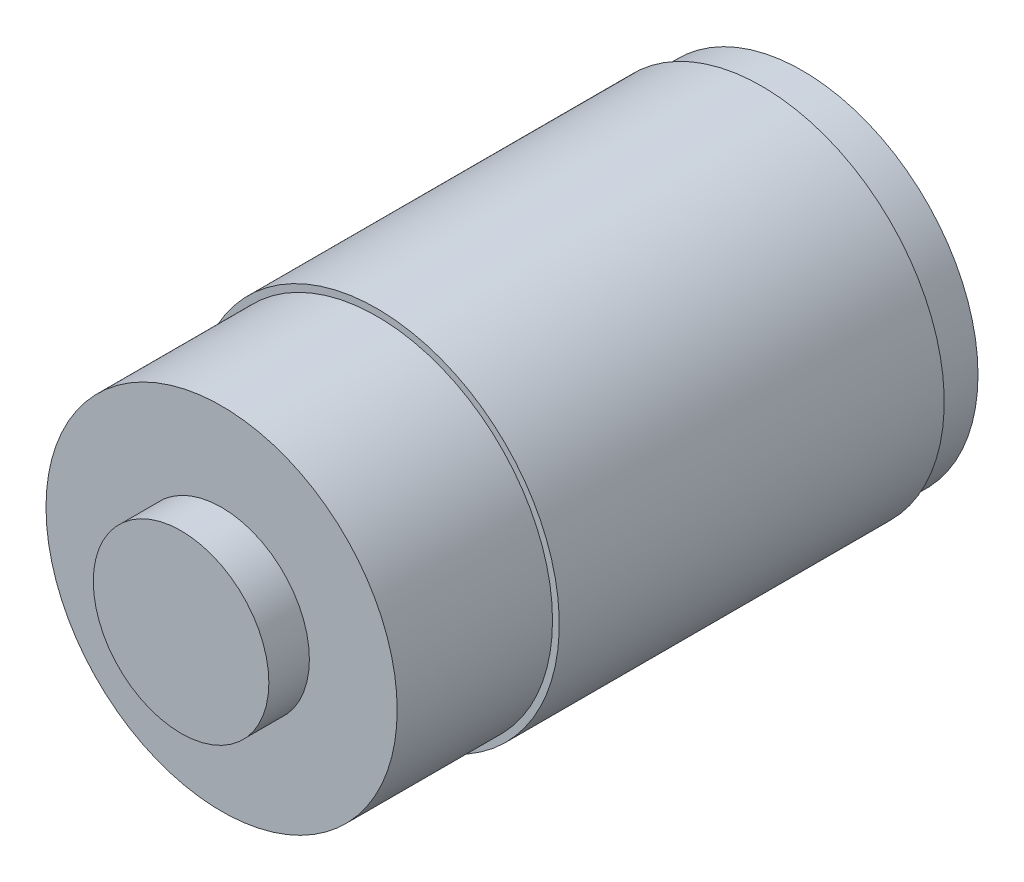
ISO-10303-21;
HEADER;
FILE_DESCRIPTION(('STEP AP214'),'2;1');
FILE_NAME('part.step','',(''),(''),'','','');
FILE_SCHEMA(('AUTOMOTIVE_DESIGN { 1 0 10303 214 1 1 1 1 }'));
ENDSEC;
DATA;
#1=APPLICATION_CONTEXT('core data for automotive mechanical design processes');
#2=APPLICATION_PROTOCOL_DEFINITION('international standard','automotive_design',2000,#1);
#3=PRODUCT_CONTEXT('',#1,'mechanical');
#4=PRODUCT('Part','Part','',(#3));
#5=PRODUCT_RELATED_PRODUCT_CATEGORY('part','',(#4));
#6=PRODUCT_DEFINITION_FORMATION('','',#4);
#7=PRODUCT_DEFINITION_CONTEXT('part definition',#1,'design');
#8=PRODUCT_DEFINITION('design','',#6,#7);
#9=PRODUCT_DEFINITION_SHAPE('','',#8);
#10=(LENGTH_UNIT() NAMED_UNIT(*) SI_UNIT(.MILLI.,.METRE.));
#11=(NAMED_UNIT(*) PLANE_ANGLE_UNIT() SI_UNIT($,.RADIAN.));
#12=(NAMED_UNIT(*) SI_UNIT($,.STERADIAN.) SOLID_ANGLE_UNIT());
#13=UNCERTAINTY_MEASURE_WITH_UNIT(LENGTH_MEASURE(1.E-05),#10,'distance_accuracy_value','');
#14=(GEOMETRIC_REPRESENTATION_CONTEXT(3) GLOBAL_UNCERTAINTY_ASSIGNED_CONTEXT((#13)) GLOBAL_UNIT_ASSIGNED_CONTEXT((#10,
#11,#12)) REPRESENTATION_CONTEXT('',''));
#15=CARTESIAN_POINT('',(0.,0.,0.));
#16=DIRECTION('',(0.,0.,1.));
#17=DIRECTION('',(1.,0.,0.));
#18=AXIS2_PLACEMENT_3D('',#15,#16,#17);
#19=CARTESIAN_POINT('',(0.,0.,57.));
#20=DIRECTION('',(0.,0.,-1.));
#21=DIRECTION('',(-1.,0.,0.));
#22=AXIS2_PLACEMENT_3D('',#19,#20,#21);
#23=CYLINDRICAL_SURFACE('',#22,27.);
#24=CARTESIAN_POINT('',(0.,0.,57.));
#25=DIRECTION('',(0.,0.,1.));
#26=DIRECTION('',(1.,0.,0.));
#27=AXIS2_PLACEMENT_3D('',#24,#25,#26);
#28=CIRCLE('',#27,27.);
#29=CARTESIAN_POINT('',(-27.,0.,57.));
#30=VERTEX_POINT('',#29);
#31=EDGE_CURVE('E63',#30,#30,#28,.T.);
#32=CARTESIAN_POINT('',(0.,0.,0.));
#33=DIRECTION('',(0.,0.,1.));
#34=DIRECTION('',(1.,0.,0.));
#35=AXIS2_PLACEMENT_3D('',#32,#33,#34);
#36=CIRCLE('',#35,27.);
#37=CARTESIAN_POINT('',(-27.,0.,0.));
#38=VERTEX_POINT('',#37);
#39=EDGE_CURVE('E42',#38,#38,#36,.T.);
#40=CARTESIAN_POINT('',(-27.,0.,57.));
#41=CARTESIAN_POINT('',(-27.,0.,56.40625));
#42=CARTESIAN_POINT('',(-27.,0.,55.8125));
#43=CARTESIAN_POINT('',(-27.,0.,54.625));
#44=CARTESIAN_POINT('',(-27.,0.,54.03125));
#45=CARTESIAN_POINT('',(-27.,0.,52.84375));
#46=CARTESIAN_POINT('',(-27.,0.,52.25));
#47=CARTESIAN_POINT('',(-27.,0.,51.0625));
#48=CARTESIAN_POINT('',(-27.,0.,50.46875));
#49=CARTESIAN_POINT('',(-27.,0.,49.28125));
#50=CARTESIAN_POINT('',(-27.,0.,48.6875));
#51=CARTESIAN_POINT('',(-27.,0.,47.5));
#52=CARTESIAN_POINT('',(-27.,0.,46.90625));
#53=CARTESIAN_POINT('',(-27.,0.,45.71875));
#54=CARTESIAN_POINT('',(-27.,0.,45.125));
#55=CARTESIAN_POINT('',(-27.,0.,43.9375));
#56=CARTESIAN_POINT('',(-27.,0.,43.34375));
#57=CARTESIAN_POINT('',(-27.,0.,42.15625));
#58=CARTESIAN_POINT('',(-27.,0.,41.5625));
#59=CARTESIAN_POINT('',(-27.,0.,40.375));
#60=CARTESIAN_POINT('',(-27.,0.,39.78125));
#61=CARTESIAN_POINT('',(-27.,0.,38.59375));
#62=CARTESIAN_POINT('',(-27.,0.,38.));
#63=CARTESIAN_POINT('',(-27.,0.,36.8125));
#64=CARTESIAN_POINT('',(-27.,0.,36.21875));
#65=CARTESIAN_POINT('',(-27.,0.,35.03125));
#66=CARTESIAN_POINT('',(-27.,0.,34.4375));
#67=CARTESIAN_POINT('',(-27.,0.,33.25));
#68=CARTESIAN_POINT('',(-27.,0.,32.65625));
#69=CARTESIAN_POINT('',(-27.,0.,31.46875));
#70=CARTESIAN_POINT('',(-27.,0.,30.875));
#71=CARTESIAN_POINT('',(-27.,0.,29.6875));
#72=CARTESIAN_POINT('',(-27.,0.,29.09375));
#73=CARTESIAN_POINT('',(-27.,0.,27.90625));
#74=CARTESIAN_POINT('',(-27.,0.,27.3125));
#75=CARTESIAN_POINT('',(-27.,0.,26.125));
#76=CARTESIAN_POINT('',(-27.,0.,25.53125));
#77=CARTESIAN_POINT('',(-27.,0.,24.34375));
#78=CARTESIAN_POINT('',(-27.,0.,23.75));
#79=CARTESIAN_POINT('',(-27.,0.,22.5625));
#80=CARTESIAN_POINT('',(-27.,0.,21.96875));
#81=CARTESIAN_POINT('',(-27.,0.,20.78125));
#82=CARTESIAN_POINT('',(-27.,0.,20.1875));
#83=CARTESIAN_POINT('',(-27.,0.,19.));
#84=CARTESIAN_POINT('',(-27.,0.,18.40625));
#85=CARTESIAN_POINT('',(-27.,0.,17.21875));
#86=CARTESIAN_POINT('',(-27.,0.,16.625));
#87=CARTESIAN_POINT('',(-27.,0.,15.4375));
#88=CARTESIAN_POINT('',(-27.,0.,14.84375));
#89=CARTESIAN_POINT('',(-27.,0.,13.65625));
#90=CARTESIAN_POINT('',(-27.,0.,13.0625));
#91=CARTESIAN_POINT('',(-27.,0.,11.875));
#92=CARTESIAN_POINT('',(-27.,0.,11.28125));
#93=CARTESIAN_POINT('',(-27.,0.,10.09375));
#94=CARTESIAN_POINT('',(-27.,0.,9.5));
#95=CARTESIAN_POINT('',(-27.,0.,8.3125));
#96=CARTESIAN_POINT('',(-27.,0.,7.71875));
#97=CARTESIAN_POINT('',(-27.,0.,6.53125));
#98=CARTESIAN_POINT('',(-27.,0.,5.9375));
#99=CARTESIAN_POINT('',(-27.,0.,4.75));
#100=CARTESIAN_POINT('',(-27.,0.,4.15625));
#101=CARTESIAN_POINT('',(-27.,0.,2.96875));
#102=CARTESIAN_POINT('',(-27.,0.,2.375));
#103=CARTESIAN_POINT('',(-27.,0.,1.1875));
#104=CARTESIAN_POINT('',(-27.,0.,0.593749999999999));
#105=CARTESIAN_POINT('',(-27.,0.,0.));
#106=B_SPLINE_CURVE_WITH_KNOTS('',3,(#40,#41,#42,#43,#44,#45,#46,#47,#48,#49,#50,#51,#52,#53,
#54,#55,#56,#57,#58,#59,#60,#61,#62,#63,#64,#65,#66,#67,#68,#69,#70,#71,#72,#73,#74,#75,#76,#77,
#78,#79,#80,#81,#82,#83,#84,#85,#86,#87,#88,#89,#90,#91,#92,#93,#94,#95,#96,#97,#98,#99,#100,
#101,#102,#103,#104,#105),.UNSPECIFIED.,.F.,.F.,(4,2,2,2,2,2,2,2,2,2,2,2,2,2,2,2,2,2,2,2,2,2,2,
2,2,2,2,2,2,2,2,2,4),(0.,1.78125,3.5625,5.34374999999999,7.12499999999999,8.90625,10.6875,
12.46875,14.25,16.03125,17.8125,19.59375,21.375,23.15625,24.9375,26.71875,28.5,30.28125,32.0625,
33.84375,35.625,37.40625,39.1875,40.96875,42.75,44.53125,46.3125,48.09375,49.875,51.65625,
53.4375,55.21875,57.),.UNSPECIFIED.);
#107=EDGE_CURVE('BSEAM39',#30,#38,#106,.T.);
#108=ORIENTED_EDGE('',*,*,#31,.F.);
#109=ORIENTED_EDGE('',*,*,#39,.T.);
#110=ORIENTED_EDGE('',*,*,#107,.T.);
#111=ORIENTED_EDGE('',*,*,#107,.F.);
#112=EDGE_LOOP('',(#108,#110,#109,#111));
#113=FACE_BOUND('',#112,.T.);
#114=ADVANCED_FACE('F39',(#113),#23,.T.);
#115=CARTESIAN_POINT('',(0.,0.,57.));
#116=DIRECTION('',(0.,0.,1.));
#117=DIRECTION('',(1.,0.,0.));
#118=AXIS2_PLACEMENT_3D('',#115,#116,#117);
#119=PLANE('',#118);
#120=CARTESIAN_POINT('',(0.,0.,57.));
#121=DIRECTION('',(0.,0.,1.));
#122=DIRECTION('',(1.,0.,0.));
#123=AXIS2_PLACEMENT_3D('',#120,#121,#122);
#124=CIRCLE('',#123,26.);
#125=CARTESIAN_POINT('',(26.,0.,57.));
#126=VERTEX_POINT('',#125);
#127=EDGE_CURVE('E51',#126,#126,#124,.T.);
#128=ORIENTED_EDGE('',*,*,#127,.F.);
#129=EDGE_LOOP('',(#128));
#130=FACE_BOUND('',#129,.T.);
#131=ORIENTED_EDGE('',*,*,#31,.T.);
#132=EDGE_LOOP('',(#131));
#133=FACE_BOUND('',#132,.T.);
#134=ADVANCED_FACE('F74',(#130,#133),#119,.T.);
#135=CARTESIAN_POINT('',(0.,0.,0.));
#136=DIRECTION('',(0.,0.,1.));
#137=DIRECTION('',(1.,0.,0.));
#138=AXIS2_PLACEMENT_3D('',#135,#136,#137);
#139=PLANE('',#138);
#140=CARTESIAN_POINT('',(0.,0.,0.));
#141=DIRECTION('',(0.,0.,-1.));
#142=DIRECTION('',(-1.,0.,0.));
#143=AXIS2_PLACEMENT_3D('',#140,#141,#142);
#144=CIRCLE('',#143,26.);
#145=CARTESIAN_POINT('',(-26.,0.,0.));
#146=VERTEX_POINT('',#145);
#147=EDGE_CURVE('E10',#146,#146,#144,.T.);
#148=ORIENTED_EDGE('',*,*,#147,.F.);
#149=EDGE_LOOP('',(#148));
#150=FACE_BOUND('',#149,.T.);
#151=ORIENTED_EDGE('',*,*,#39,.F.);
#152=EDGE_LOOP('',(#151));
#153=FACE_BOUND('',#152,.T.);
#154=ADVANCED_FACE('F71',(#150,#153),#139,.F.);
#155=CARTESIAN_POINT('',(0.,0.,80.));
#156=DIRECTION('',(0.,0.,-1.));
#157=DIRECTION('',(-1.,0.,0.));
#158=AXIS2_PLACEMENT_3D('',#155,#156,#157);
#159=CYLINDRICAL_SURFACE('',#158,26.);
#160=CARTESIAN_POINT('',(0.,0.,80.));
#161=DIRECTION('',(0.,0.,1.));
#162=DIRECTION('',(1.,0.,0.));
#163=AXIS2_PLACEMENT_3D('',#160,#161,#162);
#164=CIRCLE('',#163,26.);
#165=CARTESIAN_POINT('',(26.,0.,80.));
#166=VERTEX_POINT('',#165);
#167=EDGE_CURVE('E58',#166,#166,#164,.T.);
#168=ORIENTED_EDGE('',*,*,#167,.F.);
#169=EDGE_LOOP('',(#168));
#170=FACE_BOUND('',#169,.T.);
#171=ORIENTED_EDGE('',*,*,#127,.T.);
#172=EDGE_LOOP('',(#171));
#173=FACE_BOUND('',#172,.T.);
#174=ADVANCED_FACE('F73',(#170,#173),#159,.T.);
#175=CARTESIAN_POINT('',(0.,0.,80.));
#176=DIRECTION('',(0.,0.,1.));
#177=DIRECTION('',(1.,0.,0.));
#178=AXIS2_PLACEMENT_3D('',#175,#176,#177);
#179=PLANE('',#178);
#180=CARTESIAN_POINT('',(0.,0.,80.));
#181=DIRECTION('',(0.,0.,1.));
#182=DIRECTION('',(1.,0.,0.));
#183=AXIS2_PLACEMENT_3D('',#180,#181,#182);
#184=CIRCLE('',#183,13.);
#185=CARTESIAN_POINT('',(13.,0.,80.));
#186=VERTEX_POINT('',#185);
#187=EDGE_CURVE('E46',#186,#186,#184,.T.);
#188=ORIENTED_EDGE('',*,*,#187,.F.);
#189=EDGE_LOOP('',(#188));
#190=FACE_BOUND('',#189,.T.);
#191=ORIENTED_EDGE('',*,*,#167,.T.);
#192=EDGE_LOOP('',(#191));
#193=FACE_BOUND('',#192,.T.);
#194=ADVANCED_FACE('F81',(#190,#193),#179,.T.);
#195=CARTESIAN_POINT('',(0.,0.,86.));
#196=DIRECTION('',(0.,0.,-1.));
#197=DIRECTION('',(-1.,0.,0.));
#198=AXIS2_PLACEMENT_3D('',#195,#196,#197);
#199=CYLINDRICAL_SURFACE('',#198,13.);
#200=CARTESIAN_POINT('',(0.,0.,86.));
#201=DIRECTION('',(0.,0.,1.));
#202=DIRECTION('',(1.,0.,0.));
#203=AXIS2_PLACEMENT_3D('',#200,#201,#202);
#204=CIRCLE('',#203,13.);
#205=CARTESIAN_POINT('',(13.,0.,86.));
#206=VERTEX_POINT('',#205);
#207=EDGE_CURVE('E56',#206,#206,#204,.T.);
#208=ORIENTED_EDGE('',*,*,#207,.F.);
#209=EDGE_LOOP('',(#208));
#210=FACE_BOUND('',#209,.T.);
#211=ORIENTED_EDGE('',*,*,#187,.T.);
#212=EDGE_LOOP('',(#211));
#213=FACE_BOUND('',#212,.T.);
#214=ADVANCED_FACE('F108',(#210,#213),#199,.T.);
#215=CARTESIAN_POINT('',(0.,0.,86.));
#216=DIRECTION('',(0.,0.,1.));
#217=DIRECTION('',(1.,0.,0.));
#218=AXIS2_PLACEMENT_3D('',#215,#216,#217);
#219=PLANE('',#218);
#220=ORIENTED_EDGE('',*,*,#207,.T.);
#221=EDGE_LOOP('',(#220));
#222=FACE_BOUND('',#221,.T.);
#223=ADVANCED_FACE('F116',(#222),#219,.T.);
#224=CARTESIAN_POINT('',(0.,0.,-6.));
#225=DIRECTION('',(0.,0.,1.));
#226=DIRECTION('',(1.,0.,0.));
#227=AXIS2_PLACEMENT_3D('',#224,#225,#226);
#228=CYLINDRICAL_SURFACE('',#227,26.);
#229=CARTESIAN_POINT('',(0.,0.,-6.));
#230=DIRECTION('',(0.,0.,-1.));
#231=DIRECTION('',(-1.,0.,0.));
#232=AXIS2_PLACEMENT_3D('',#229,#230,#231);
#233=CIRCLE('',#232,26.);
#234=CARTESIAN_POINT('',(-26.,0.,-6.));
#235=VERTEX_POINT('',#234);
#236=EDGE_CURVE('E55',#235,#235,#233,.T.);
#237=ORIENTED_EDGE('',*,*,#236,.F.);
#238=EDGE_LOOP('',(#237));
#239=FACE_BOUND('',#238,.T.);
#240=ORIENTED_EDGE('',*,*,#147,.T.);
#241=EDGE_LOOP('',(#240));
#242=FACE_BOUND('',#241,.T.);
#243=ADVANCED_FACE('F124',(#239,#242),#228,.T.);
#244=CARTESIAN_POINT('',(0.,0.,-6.));
#245=DIRECTION('',(0.,0.,-1.));
#246=DIRECTION('',(-1.,0.,0.));
#247=AXIS2_PLACEMENT_3D('',#244,#245,#246);
#248=PLANE('',#247);
#249=ORIENTED_EDGE('',*,*,#236,.T.);
#250=EDGE_LOOP('',(#249));
#251=FACE_BOUND('',#250,.T.);
#252=ADVANCED_FACE('F136',(#251),#248,.T.);
#253=CLOSED_SHELL('',(#114,#134,#154,#174,#194,#214,#223,#243,#252));
#254=MANIFOLD_SOLID_BREP('B2',#253);
#255=ADVANCED_BREP_SHAPE_REPRESENTATION('',(#18,#254),#14);
#256=SHAPE_DEFINITION_REPRESENTATION(#9,#255);
ENDSEC;
END-ISO-10303-21;
